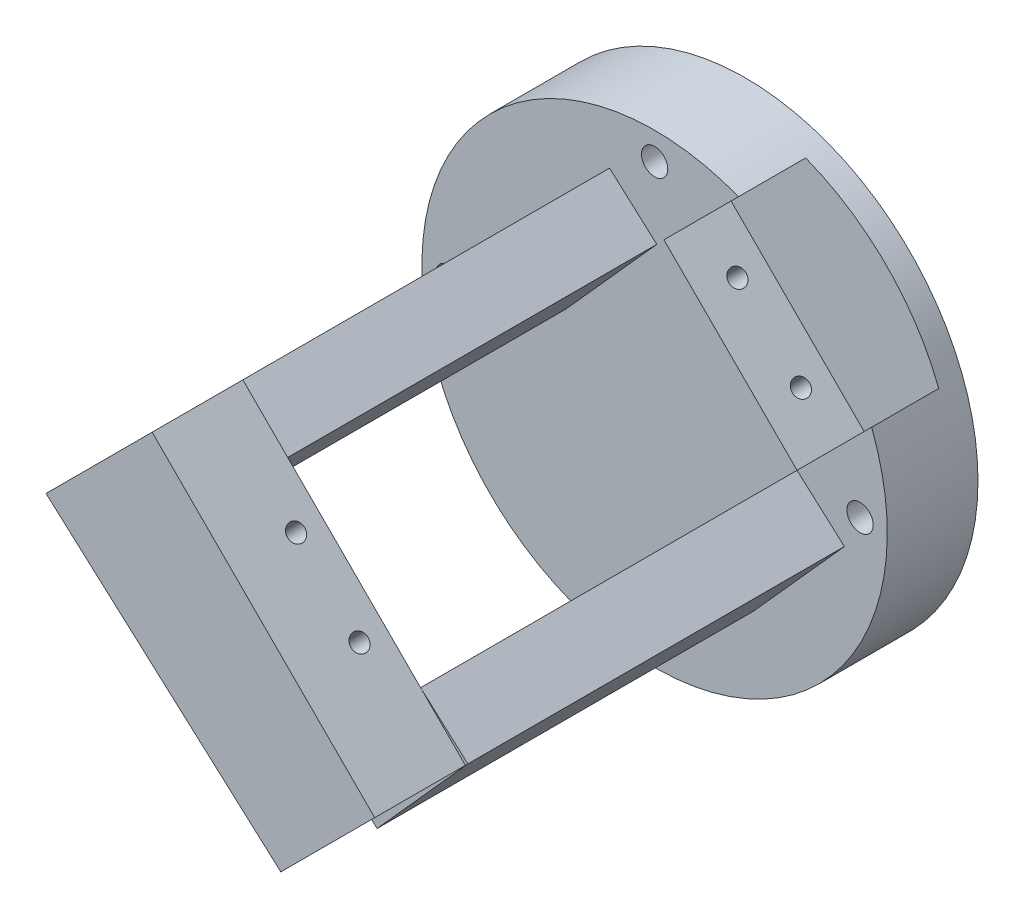
ISO-10303-21;
HEADER;
FILE_DESCRIPTION(('STEP AP214'),'2;1');
FILE_NAME('part.step','',(''),(''),'','','');
FILE_SCHEMA(('AUTOMOTIVE_DESIGN { 1 0 10303 214 1 1 1 1 }'));
ENDSEC;
DATA;
#1=APPLICATION_CONTEXT('core data for automotive mechanical design processes');
#2=APPLICATION_PROTOCOL_DEFINITION('international standard','automotive_design',2000,#1);
#3=PRODUCT_CONTEXT('',#1,'mechanical');
#4=PRODUCT('Part','Part','',(#3));
#5=PRODUCT_RELATED_PRODUCT_CATEGORY('part','',(#4));
#6=PRODUCT_DEFINITION_FORMATION('','',#4);
#7=PRODUCT_DEFINITION_CONTEXT('part definition',#1,'design');
#8=PRODUCT_DEFINITION('design','',#6,#7);
#9=PRODUCT_DEFINITION_SHAPE('','',#8);
#10=(LENGTH_UNIT() NAMED_UNIT(*) SI_UNIT(.MILLI.,.METRE.));
#11=(NAMED_UNIT(*) PLANE_ANGLE_UNIT() SI_UNIT($,.RADIAN.));
#12=(NAMED_UNIT(*) SI_UNIT($,.STERADIAN.) SOLID_ANGLE_UNIT());
#13=UNCERTAINTY_MEASURE_WITH_UNIT(LENGTH_MEASURE(1.E-05),#10,'distance_accuracy_value','');
#14=(GEOMETRIC_REPRESENTATION_CONTEXT(3) GLOBAL_UNCERTAINTY_ASSIGNED_CONTEXT((#13)) GLOBAL_UNIT_ASSIGNED_CONTEXT((#10,
#11,#12)) REPRESENTATION_CONTEXT('',''));
#15=CARTESIAN_POINT('',(0.,0.,0.));
#16=DIRECTION('',(0.,0.,1.));
#17=DIRECTION('',(1.,0.,0.));
#18=AXIS2_PLACEMENT_3D('',#15,#16,#17);
#19=CARTESIAN_POINT('',(0.,0.,51.5));
#20=DIRECTION('',(0.,0.,-1.));
#21=DIRECTION('',(-1.,0.,0.));
#22=AXIS2_PLACEMENT_3D('',#19,#20,#21);
#23=PLANE('',#22);
#24=DIRECTION('',(-0.707106781186547,0.707106781186548,0.));
#25=VECTOR('',#24,1.);
#26=CARTESIAN_POINT('',(20.6435839937851,-3.9134375509114,51.5));
#27=LINE('',#26,#25);
#28=CARTESIAN_POINT('',(20.6435839937851,-3.9134375509114,51.5));
#29=VERTEX_POINT('',#28);
#30=CARTESIAN_POINT('',(15.7013060762473,1.02884036662643,51.5));
#31=VERTEX_POINT('',#30);
#32=EDGE_CURVE('E162',#29,#31,#27,.T.);
#33=ORIENTED_EDGE('',*,*,#32,.F.);
#34=DIRECTION('',(0.707106781186548,0.707106781186547,0.));
#35=VECTOR('',#34,1.);
#36=CARTESIAN_POINT('',(-15.9347408033612,-40.4917623480576,51.5));
#37=LINE('',#36,#35);
#38=CARTESIAN_POINT('',(10.2927771901674,-14.2642443545291,51.5));
#39=VERTEX_POINT('',#38);
#40=EDGE_CURVE('E58',#39,#29,#37,.T.);
#41=ORIENTED_EDGE('',*,*,#40,.F.);
#42=DIRECTION('',(0.744871886143202,-0.667207518867608,0.));
#43=VECTOR('',#42,1.);
#44=CARTESIAN_POINT('',(5.69319329323317,-10.1442379255216,51.5));
#45=LINE('',#44,#43);
#46=CARTESIAN_POINT('',(10.9072964962356,-14.8146905575949,51.5));
#47=VERTEX_POINT('',#46);
#48=EDGE_CURVE('E207',#39,#47,#45,.T.);
#49=ORIENTED_EDGE('',*,*,#48,.T.);
#50=DIRECTION('',(0.667207518867608,0.744871886143202,0.));
#51=VECTOR('',#50,1.);
#52=CARTESIAN_POINT('',(20.9154092792497,-3.64161226544682,51.5));
#53=LINE('',#52,#51);
#54=CARTESIAN_POINT('',(20.9154092792497,-3.64161226544682,51.5));
#55=VERTEX_POINT('',#54);
#56=EDGE_CURVE('E209',#47,#55,#53,.T.);
#57=ORIENTED_EDGE('',*,*,#56,.T.);
#58=DIRECTION('',(-0.744871886143202,0.667207518867608,0.));
#59=VECTOR('',#58,1.);
#60=CARTESIAN_POINT('',(15.7013060762473,1.02884036662643,51.5));
#61=LINE('',#60,#59);
#62=EDGE_CURVE('E201',#55,#31,#61,.T.);
#63=ORIENTED_EDGE('',*,*,#62,.T.);
#64=EDGE_LOOP('',(#33,#41,#49,#57,#63));
#65=FACE_BOUND('',#64,.T.);
#66=ADVANCED_FACE('F43',(#65),#23,.F.);
#67=CARTESIAN_POINT('',(0.,0.,10.));
#68=DIRECTION('',(0.,0.,1.));
#69=DIRECTION('',(1.,0.,0.));
#70=AXIS2_PLACEMENT_3D('',#67,#68,#69);
#71=PLANE('',#70);
#72=DIRECTION('',(-0.744871886143202,0.667207518867608,0.));
#73=VECTOR('',#72,1.);
#74=CARTESIAN_POINT('',(15.7013060762473,1.02884036662643,10.));
#75=LINE('',#74,#73);
#76=CARTESIAN_POINT('',(20.9154092792497,-3.64161226544682,10.));
#77=VERTEX_POINT('',#76);
#78=CARTESIAN_POINT('',(15.7013060762473,1.02884036662643,10.));
#79=VERTEX_POINT('',#78);
#80=EDGE_CURVE('E66',#77,#79,#75,.T.);
#81=ORIENTED_EDGE('',*,*,#80,.F.);
#82=DIRECTION('',(0.667207518867608,0.744871886143202,0.));
#83=VECTOR('',#82,1.);
#84=CARTESIAN_POINT('',(20.9154092792497,-3.64161226544682,10.));
#85=LINE('',#84,#83);
#86=CARTESIAN_POINT('',(10.9072964962356,-14.8146905575949,10.));
#87=VERTEX_POINT('',#86);
#88=EDGE_CURVE('E205',#87,#77,#85,.T.);
#89=ORIENTED_EDGE('',*,*,#88,.F.);
#90=DIRECTION('',(0.744871886143202,-0.667207518867608,0.));
#91=VECTOR('',#90,1.);
#92=CARTESIAN_POINT('',(5.69319329323317,-10.1442379255216,10.));
#93=LINE('',#92,#91);
#94=CARTESIAN_POINT('',(5.69319329323317,-10.1442379255216,10.));
#95=VERTEX_POINT('',#94);
#96=EDGE_CURVE('E217',#95,#87,#93,.T.);
#97=ORIENTED_EDGE('',*,*,#96,.F.);
#98=DIRECTION('',(-0.667207518867608,-0.744871886143202,0.));
#99=VECTOR('',#98,1.);
#100=CARTESIAN_POINT('',(15.7013060762473,1.02884036662643,10.));
#101=LINE('',#100,#99);
#102=EDGE_CURVE('E213',#79,#95,#101,.T.);
#103=ORIENTED_EDGE('',*,*,#102,.F.);
#104=DIRECTION('',(0.707106781186548,-0.707106781186548,0.));
#105=VECTOR('',#104,1.);
#106=CARTESIAN_POINT('',(1.02884036662643,15.7013060762473,9.99999999999999));
#107=LINE('',#106,#105);
#108=CARTESIAN_POINT('',(1.02884036662643,15.7013060762473,10.));
#109=VERTEX_POINT('',#108);
#110=EDGE_CURVE('E258',#109,#79,#107,.T.);
#111=ORIENTED_EDGE('',*,*,#110,.F.);
#112=DIRECTION('',(-0.707106781186548,-0.707106781186548,0.));
#113=VECTOR('',#112,1.);
#114=CARTESIAN_POINT('',(1.02884036662643,15.7013060762473,9.99999999999999));
#115=LINE('',#114,#113);
#116=CARTESIAN_POINT('',(9.25113997816105,23.9236056877819,10.));
#117=VERTEX_POINT('',#116);
#118=EDGE_CURVE('E261',#117,#109,#115,.T.);
#119=ORIENTED_EDGE('',*,*,#118,.F.);
#120=CARTESIAN_POINT('',(0.,0.,10.));
#121=DIRECTION('',(0.,0.,1.));
#122=DIRECTION('',(1.,0.,0.));
#123=AXIS2_PLACEMENT_3D('',#120,#121,#122);
#124=CIRCLE('',#123,25.65);
#125=CARTESIAN_POINT('',(23.9236056877819,9.25113997816105,10.));
#126=VERTEX_POINT('',#125);
#127=EDGE_CURVE('E11',#117,#126,#124,.T.);
#128=ORIENTED_EDGE('',*,*,#127,.T.);
#129=DIRECTION('',(0.707106781186547,0.707106781186548,0.));
#130=VECTOR('',#129,1.);
#131=CARTESIAN_POINT('',(15.7013060762473,1.02884036662643,9.99999999999999));
#132=LINE('',#131,#130);
#133=EDGE_CURVE('E262',#79,#126,#132,.T.);
#134=ORIENTED_EDGE('',*,*,#133,.F.);
#135=EDGE_LOOP('',(#81,#89,#97,#103,#111,#119,#128,#134));
#136=FACE_BOUND('',#135,.T.);
#137=CARTESIAN_POINT('',(2.37246156974391E-13,22.65,10.));
#138=DIRECTION('',(0.,0.,1.));
#139=DIRECTION('',(1.,0.,0.));
#140=AXIS2_PLACEMENT_3D('',#137,#138,#139);
#141=CIRCLE('',#140,1.45);
#142=CARTESIAN_POINT('',(1.45000000000024,22.65,10.));
#143=VERTEX_POINT('',#142);
#144=EDGE_CURVE('E294',#143,#143,#141,.T.);
#145=ORIENTED_EDGE('',*,*,#144,.F.);
#146=EDGE_LOOP('',(#145));
#147=FACE_BOUND('',#146,.T.);
#148=CARTESIAN_POINT('',(0.,-22.65,10.));
#149=DIRECTION('',(0.,0.,1.));
#150=DIRECTION('',(1.,0.,0.));
#151=AXIS2_PLACEMENT_3D('',#148,#149,#150);
#152=CIRCLE('',#151,1.45);
#153=CARTESIAN_POINT('',(1.44999999999992,-22.65,10.));
#154=VERTEX_POINT('',#153);
#155=EDGE_CURVE('E306',#154,#154,#152,.T.);
#156=ORIENTED_EDGE('',*,*,#155,.F.);
#157=EDGE_LOOP('',(#156));
#158=FACE_BOUND('',#157,.T.);
#159=CARTESIAN_POINT('',(22.65,0.,10.));
#160=DIRECTION('',(0.,0.,1.));
#161=DIRECTION('',(1.,0.,0.));
#162=AXIS2_PLACEMENT_3D('',#159,#160,#161);
#163=CIRCLE('',#162,1.45);
#164=CARTESIAN_POINT('',(24.1,0.,10.));
#165=VERTEX_POINT('',#164);
#166=EDGE_CURVE('E300',#165,#165,#163,.T.);
#167=ORIENTED_EDGE('',*,*,#166,.F.);
#168=EDGE_LOOP('',(#167));
#169=FACE_BOUND('',#168,.T.);
#170=CARTESIAN_POINT('',(-22.65,1.58164104649594E-13,10.));
#171=DIRECTION('',(0.,0.,1.));
#172=DIRECTION('',(1.,0.,0.));
#173=AXIS2_PLACEMENT_3D('',#170,#171,#172);
#174=CIRCLE('',#173,1.45);
#175=CARTESIAN_POINT('',(-21.2,1.58164104649594E-13,10.));
#176=VERTEX_POINT('',#175);
#177=EDGE_CURVE('E288',#176,#176,#174,.T.);
#178=ORIENTED_EDGE('',*,*,#177,.F.);
#179=EDGE_LOOP('',(#178));
#180=FACE_BOUND('',#179,.T.);
#181=DIRECTION('',(-0.744871886143202,0.667207518867608,0.));
#182=VECTOR('',#181,1.);
#183=CARTESIAN_POINT('',(0.245214438775858,14.8733963831293,10.));
#184=LINE('',#183,#182);
#185=CARTESIAN_POINT('',(0.245214438775858,14.8733963831293,10.));
#186=VERTEX_POINT('',#185);
#187=CARTESIAN_POINT('',(-4.96888876422655,19.5438490152025,10.));
#188=VERTEX_POINT('',#187);
#189=EDGE_CURVE('E250',#186,#188,#184,.T.);
#190=ORIENTED_EDGE('',*,*,#189,.F.);
#191=DIRECTION('',(0.667207518867607,0.744871886143202,0.));
#192=VECTOR('',#191,1.);
#193=CARTESIAN_POINT('',(0.245214438775858,14.8733963831293,10.));
#194=LINE('',#193,#192);
#195=CARTESIAN_POINT('',(-9.76289834423825,3.70031809098124,10.));
#196=VERTEX_POINT('',#195);
#197=EDGE_CURVE('E214',#196,#186,#194,.T.);
#198=ORIENTED_EDGE('',*,*,#197,.F.);
#199=DIRECTION('',(0.744871886143202,-0.667207518867608,0.));
#200=VECTOR('',#199,1.);
#201=CARTESIAN_POINT('',(-9.76289834423825,3.70031809098124,10.));
#202=LINE('',#201,#200);
#203=CARTESIAN_POINT('',(-14.9770015472407,8.37077072305449,10.));
#204=VERTEX_POINT('',#203);
#205=EDGE_CURVE('E244',#204,#196,#202,.T.);
#206=ORIENTED_EDGE('',*,*,#205,.F.);
#207=DIRECTION('',(-0.667207518867608,-0.744871886143202,0.));
#208=VECTOR('',#207,1.);
#209=CARTESIAN_POINT('',(-4.96888876422655,19.5438490152025,10.));
#210=LINE('',#209,#208);
#211=EDGE_CURVE('E246',#188,#204,#210,.T.);
#212=ORIENTED_EDGE('',*,*,#211,.F.);
#213=EDGE_LOOP('',(#190,#198,#206,#212));
#214=FACE_BOUND('',#213,.T.);
#215=ADVANCED_FACE('F330',(#136,#147,#158,#169,#180,#214),#71,.T.);
#216=CARTESIAN_POINT('',(0.,0.,10.));
#217=DIRECTION('',(0.,0.,-1.));
#218=DIRECTION('',(-1.,0.,0.));
#219=AXIS2_PLACEMENT_3D('',#216,#217,#218);
#220=CYLINDRICAL_SURFACE('',#219,25.65);
#221=CARTESIAN_POINT('',(0.,0.,0.));
#222=DIRECTION('',(0.,0.,1.));
#223=DIRECTION('',(1.,0.,0.));
#224=AXIS2_PLACEMENT_3D('',#221,#222,#223);
#225=CIRCLE('',#224,25.65);
#226=CARTESIAN_POINT('',(25.65,0.,0.));
#227=VERTEX_POINT('',#226);
#228=EDGE_CURVE('E47',#227,#227,#225,.T.);
#229=ORIENTED_EDGE('',*,*,#228,.T.);
#230=EDGE_LOOP('',(#229));
#231=FACE_BOUND('',#230,.T.);
#232=DIRECTION('',(0.,0.,-1.));
#233=VECTOR('',#232,1.);
#234=CARTESIAN_POINT('',(23.9236056877819,9.25113997816105,101.543876092287));
#235=LINE('',#234,#233);
#236=CARTESIAN_POINT('',(23.9236056877819,9.25113997816105,2.6));
#237=VERTEX_POINT('',#236);
#238=EDGE_CURVE('E278',#126,#237,#235,.T.);
#239=ORIENTED_EDGE('',*,*,#238,.F.);
#240=ORIENTED_EDGE('',*,*,#127,.F.);
#241=DIRECTION('',(0.,0.,-1.));
#242=VECTOR('',#241,1.);
#243=CARTESIAN_POINT('',(9.25113997816105,23.9236056877819,101.543876092287));
#244=LINE('',#243,#242);
#245=CARTESIAN_POINT('',(9.25113997816105,23.9236056877819,2.6));
#246=VERTEX_POINT('',#245);
#247=EDGE_CURVE('E273',#117,#246,#244,.T.);
#248=ORIENTED_EDGE('',*,*,#247,.T.);
#249=CARTESIAN_POINT('',(0.,0.,2.6));
#250=DIRECTION('',(0.,0.,1.));
#251=DIRECTION('',(1.,0.,0.));
#252=AXIS2_PLACEMENT_3D('',#249,#250,#251);
#253=CIRCLE('',#252,25.65);
#254=EDGE_CURVE('E232',#237,#246,#253,.T.);
#255=ORIENTED_EDGE('',*,*,#254,.F.);
#256=EDGE_LOOP('',(#239,#240,#248,#255));
#257=FACE_BOUND('',#256,.T.);
#258=ADVANCED_FACE('F45',(#231,#257),#220,.T.);
#259=CARTESIAN_POINT('',(0.,0.,0.));
#260=DIRECTION('',(0.,0.,1.));
#261=DIRECTION('',(1.,0.,0.));
#262=AXIS2_PLACEMENT_3D('',#259,#260,#261);
#263=PLANE('',#262);
#264=ORIENTED_EDGE('',*,*,#228,.F.);
#265=EDGE_LOOP('',(#264));
#266=FACE_BOUND('',#265,.T.);
#267=CARTESIAN_POINT('',(0.,-22.65,0.));
#268=DIRECTION('',(0.,0.,1.));
#269=DIRECTION('',(1.,0.,0.));
#270=AXIS2_PLACEMENT_3D('',#267,#268,#269);
#271=CIRCLE('',#270,1.45);
#272=CARTESIAN_POINT('',(1.44999999999992,-22.65,0.));
#273=VERTEX_POINT('',#272);
#274=EDGE_CURVE('E303',#273,#273,#271,.T.);
#275=ORIENTED_EDGE('',*,*,#274,.T.);
#276=EDGE_LOOP('',(#275));
#277=FACE_BOUND('',#276,.T.);
#278=CARTESIAN_POINT('',(22.65,0.,0.));
#279=DIRECTION('',(0.,0.,1.));
#280=DIRECTION('',(1.,0.,0.));
#281=AXIS2_PLACEMENT_3D('',#278,#279,#280);
#282=CIRCLE('',#281,1.45);
#283=CARTESIAN_POINT('',(24.1,0.,0.));
#284=VERTEX_POINT('',#283);
#285=EDGE_CURVE('E297',#284,#284,#282,.T.);
#286=ORIENTED_EDGE('',*,*,#285,.T.);
#287=EDGE_LOOP('',(#286));
#288=FACE_BOUND('',#287,.T.);
#289=CARTESIAN_POINT('',(2.37246156974391E-13,22.65,0.));
#290=DIRECTION('',(0.,0.,1.));
#291=DIRECTION('',(1.,0.,0.));
#292=AXIS2_PLACEMENT_3D('',#289,#290,#291);
#293=CIRCLE('',#292,1.45);
#294=CARTESIAN_POINT('',(1.45000000000024,22.65,0.));
#295=VERTEX_POINT('',#294);
#296=EDGE_CURVE('E291',#295,#295,#293,.T.);
#297=ORIENTED_EDGE('',*,*,#296,.T.);
#298=EDGE_LOOP('',(#297));
#299=FACE_BOUND('',#298,.T.);
#300=CARTESIAN_POINT('',(-22.65,1.58164104649594E-13,0.));
#301=DIRECTION('',(0.,0.,1.));
#302=DIRECTION('',(1.,0.,0.));
#303=AXIS2_PLACEMENT_3D('',#300,#301,#302);
#304=CIRCLE('',#303,1.45);
#305=CARTESIAN_POINT('',(-21.2,1.58164104649594E-13,0.));
#306=VERTEX_POINT('',#305);
#307=EDGE_CURVE('E265',#306,#306,#304,.T.);
#308=ORIENTED_EDGE('',*,*,#307,.T.);
#309=EDGE_LOOP('',(#308));
#310=FACE_BOUND('',#309,.T.);
#311=ADVANCED_FACE('F312',(#266,#277,#288,#299,#310),#263,.F.);
#312=CARTESIAN_POINT('',(0.,-22.65,10.));
#313=DIRECTION('',(0.,0.,-1.));
#314=DIRECTION('',(-1.,0.,0.));
#315=AXIS2_PLACEMENT_3D('',#312,#313,#314);
#316=CYLINDRICAL_SURFACE('',#315,1.45);
#317=ORIENTED_EDGE('',*,*,#155,.T.);
#318=EDGE_LOOP('',(#317));
#319=FACE_BOUND('',#318,.T.);
#320=ORIENTED_EDGE('',*,*,#274,.F.);
#321=EDGE_LOOP('',(#320));
#322=FACE_BOUND('',#321,.T.);
#323=ADVANCED_FACE('F315',(#319,#322),#316,.F.);
#324=CARTESIAN_POINT('',(22.65,0.,10.));
#325=DIRECTION('',(0.,0.,-1.));
#326=DIRECTION('',(-1.,0.,0.));
#327=AXIS2_PLACEMENT_3D('',#324,#325,#326);
#328=CYLINDRICAL_SURFACE('',#327,1.45);
#329=ORIENTED_EDGE('',*,*,#166,.T.);
#330=EDGE_LOOP('',(#329));
#331=FACE_BOUND('',#330,.T.);
#332=ORIENTED_EDGE('',*,*,#285,.F.);
#333=EDGE_LOOP('',(#332));
#334=FACE_BOUND('',#333,.T.);
#335=ADVANCED_FACE('F317',(#331,#334),#328,.F.);
#336=CARTESIAN_POINT('',(2.37246156974391E-13,22.65,10.));
#337=DIRECTION('',(0.,0.,-1.));
#338=DIRECTION('',(-1.,0.,0.));
#339=AXIS2_PLACEMENT_3D('',#336,#337,#338);
#340=CYLINDRICAL_SURFACE('',#339,1.45);
#341=ORIENTED_EDGE('',*,*,#144,.T.);
#342=EDGE_LOOP('',(#341));
#343=FACE_BOUND('',#342,.T.);
#344=ORIENTED_EDGE('',*,*,#296,.F.);
#345=EDGE_LOOP('',(#344));
#346=FACE_BOUND('',#345,.T.);
#347=ADVANCED_FACE('F324',(#343,#346),#340,.F.);
#348=CARTESIAN_POINT('',(-22.65,1.58164104649594E-13,10.));
#349=DIRECTION('',(0.,0.,-1.));
#350=DIRECTION('',(-1.,0.,0.));
#351=AXIS2_PLACEMENT_3D('',#348,#349,#350);
#352=CYLINDRICAL_SURFACE('',#351,1.45);
#353=ORIENTED_EDGE('',*,*,#177,.T.);
#354=EDGE_LOOP('',(#353));
#355=FACE_BOUND('',#354,.T.);
#356=ORIENTED_EDGE('',*,*,#307,.F.);
#357=EDGE_LOOP('',(#356));
#358=FACE_BOUND('',#357,.T.);
#359=ADVANCED_FACE('F372',(#355,#358),#352,.F.);
#360=CARTESIAN_POINT('',(15.7013060762473,1.02884036662643,101.543876092287));
#361=DIRECTION('',(-0.707106781186548,0.707106781186547,0.));
#362=DIRECTION('',(-0.707106781186547,-0.707106781186548,0.));
#363=AXIS2_PLACEMENT_3D('',#360,#361,#362);
#364=PLANE('',#363);
#365=DIRECTION('',(0.,0.,-1.));
#366=VECTOR('',#365,1.);
#367=CARTESIAN_POINT('',(15.7013060762473,1.02884036662643,101.543876092287));
#368=LINE('',#367,#366);
#369=CARTESIAN_POINT('',(15.7013060762473,1.02884036662643,2.6));
#370=VERTEX_POINT('',#369);
#371=EDGE_CURVE('E281',#79,#370,#368,.T.);
#372=ORIENTED_EDGE('',*,*,#371,.F.);
#373=ORIENTED_EDGE('',*,*,#133,.T.);
#374=ORIENTED_EDGE('',*,*,#238,.T.);
#375=DIRECTION('',(0.707106781186547,0.707106781186548,0.));
#376=VECTOR('',#375,1.);
#377=CARTESIAN_POINT('',(15.7013060762473,1.02884036662643,2.6));
#378=LINE('',#377,#376);
#379=EDGE_CURVE('E270',#370,#237,#378,.T.);
#380=ORIENTED_EDGE('',*,*,#379,.F.);
#381=EDGE_LOOP('',(#372,#373,#374,#380));
#382=FACE_BOUND('',#381,.T.);
#383=ADVANCED_FACE('F368',(#382),#364,.T.);
#384=CARTESIAN_POINT('',(1.02884036662643,15.7013060762473,101.543876092287));
#385=DIRECTION('',(0.707106781186547,0.707106781186547,0.));
#386=DIRECTION('',(-0.707106781186548,0.707106781186548,0.));
#387=AXIS2_PLACEMENT_3D('',#384,#385,#386);
#388=PLANE('',#387);
#389=CARTESIAN_POINT('',(4.86489465456345,11.8652517883103,5.74));
#390=DIRECTION('',(0.707106781186548,0.707106781186547,0.));
#391=DIRECTION('',(-0.707106781186547,0.707106781186548,0.));
#392=AXIS2_PLACEMENT_3D('',#389,#390,#391);
#393=CIRCLE('',#392,0.95);
#394=CARTESIAN_POINT('',(4.19314321243623,12.5370032304375,5.74));
#395=VERTEX_POINT('',#394);
#396=EDGE_CURVE('E527',#395,#395,#393,.T.);
#397=ORIENTED_EDGE('',*,*,#396,.F.);
#398=EDGE_LOOP('',(#397));
#399=FACE_BOUND('',#398,.T.);
#400=CARTESIAN_POINT('',(11.8652517883103,4.86489465456345,5.73999999999999));
#401=DIRECTION('',(0.707106781186548,0.707106781186547,0.));
#402=DIRECTION('',(-0.707106781186547,0.707106781186548,0.));
#403=AXIS2_PLACEMENT_3D('',#400,#401,#402);
#404=CIRCLE('',#403,0.949999999999999);
#405=CARTESIAN_POINT('',(11.193500346183,5.53664609669067,5.73999999999999));
#406=VERTEX_POINT('',#405);
#407=EDGE_CURVE('E530',#406,#406,#404,.T.);
#408=ORIENTED_EDGE('',*,*,#407,.F.);
#409=EDGE_LOOP('',(#408));
#410=FACE_BOUND('',#409,.T.);
#411=DIRECTION('',(0.,0.,-1.));
#412=VECTOR('',#411,1.);
#413=CARTESIAN_POINT('',(1.02884036662643,15.7013060762473,101.543876092287));
#414=LINE('',#413,#412);
#415=CARTESIAN_POINT('',(1.02884036662643,15.7013060762473,2.6));
#416=VERTEX_POINT('',#415);
#417=EDGE_CURVE('E275',#109,#416,#414,.T.);
#418=ORIENTED_EDGE('',*,*,#417,.F.);
#419=ORIENTED_EDGE('',*,*,#110,.T.);
#420=ORIENTED_EDGE('',*,*,#371,.T.);
#421=DIRECTION('',(0.707106781186548,-0.707106781186548,0.));
#422=VECTOR('',#421,1.);
#423=CARTESIAN_POINT('',(1.02884036662643,15.7013060762473,2.6));
#424=LINE('',#423,#422);
#425=EDGE_CURVE('E268',#416,#370,#424,.T.);
#426=ORIENTED_EDGE('',*,*,#425,.F.);
#427=EDGE_LOOP('',(#418,#419,#420,#426));
#428=FACE_BOUND('',#427,.T.);
#429=ADVANCED_FACE('F371',(#399,#410,#428),#388,.T.);
#430=CARTESIAN_POINT('',(1.02884036662643,15.7013060762473,101.543876092287));
#431=DIRECTION('',(0.707106781186548,-0.707106781186548,0.));
#432=DIRECTION('',(0.707106781186548,0.707106781186548,0.));
#433=AXIS2_PLACEMENT_3D('',#430,#431,#432);
#434=PLANE('',#433);
#435=ORIENTED_EDGE('',*,*,#247,.F.);
#436=ORIENTED_EDGE('',*,*,#118,.T.);
#437=ORIENTED_EDGE('',*,*,#417,.T.);
#438=DIRECTION('',(-0.707106781186548,-0.707106781186548,0.));
#439=VECTOR('',#438,1.);
#440=CARTESIAN_POINT('',(1.02884036662643,15.7013060762473,2.6));
#441=LINE('',#440,#439);
#442=EDGE_CURVE('E266',#246,#416,#441,.T.);
#443=ORIENTED_EDGE('',*,*,#442,.F.);
#444=EDGE_LOOP('',(#435,#436,#437,#443));
#445=FACE_BOUND('',#444,.T.);
#446=ADVANCED_FACE('F376',(#445),#434,.T.);
#447=CARTESIAN_POINT('',(0.,0.,2.6));
#448=DIRECTION('',(0.,0.,1.));
#449=DIRECTION('',(1.,0.,0.));
#450=AXIS2_PLACEMENT_3D('',#447,#448,#449);
#451=PLANE('',#450);
#452=ORIENTED_EDGE('',*,*,#442,.T.);
#453=ORIENTED_EDGE('',*,*,#425,.T.);
#454=ORIENTED_EDGE('',*,*,#379,.T.);
#455=ORIENTED_EDGE('',*,*,#254,.T.);
#456=EDGE_LOOP('',(#452,#453,#454,#455));
#457=FACE_BOUND('',#456,.T.);
#458=ADVANCED_FACE('F360',(#457),#451,.T.);
#459=CARTESIAN_POINT('',(0.245214438775858,14.8733963831293,51.5));
#460=DIRECTION('',(-0.744871886143202,0.667207518867607,0.));
#461=DIRECTION('',(-0.667207518867607,-0.744871886143202,0.));
#462=AXIS2_PLACEMENT_3D('',#459,#460,#461);
#463=PLANE('',#462);
#464=ORIENTED_EDGE('',*,*,#197,.T.);
#465=DIRECTION('',(0.,0.,-1.));
#466=VECTOR('',#465,1.);
#467=CARTESIAN_POINT('',(0.245214438775858,14.8733963831293,51.5));
#468=LINE('',#467,#466);
#469=CARTESIAN_POINT('',(0.245214438775858,14.8733963831293,51.5));
#470=VERTEX_POINT('',#469);
#471=EDGE_CURVE('E233',#470,#186,#468,.T.);
#472=ORIENTED_EDGE('',*,*,#471,.F.);
#473=DIRECTION('',(0.667207518867607,0.744871886143202,0.));
#474=VECTOR('',#473,1.);
#475=CARTESIAN_POINT('',(0.245214438775858,14.8733963831293,51.5));
#476=LINE('',#475,#474);
#477=CARTESIAN_POINT('',(-9.76289834423825,3.70031809098124,51.5));
#478=VERTEX_POINT('',#477);
#479=EDGE_CURVE('E247',#478,#470,#476,.T.);
#480=ORIENTED_EDGE('',*,*,#479,.F.);
#481=DIRECTION('',(0.,0.,-1.));
#482=VECTOR('',#481,1.);
#483=CARTESIAN_POINT('',(-9.76289834423825,3.70031809098124,51.5));
#484=LINE('',#483,#482);
#485=EDGE_CURVE('E240',#478,#196,#484,.T.);
#486=ORIENTED_EDGE('',*,*,#485,.T.);
#487=EDGE_LOOP('',(#464,#472,#480,#486));
#488=FACE_BOUND('',#487,.T.);
#489=ADVANCED_FACE('F357',(#488),#463,.F.);
#490=CARTESIAN_POINT('',(0.245214438775858,14.8733963831293,51.5));
#491=DIRECTION('',(-0.667207518867608,-0.744871886143202,0.));
#492=DIRECTION('',(0.744871886143202,-0.667207518867608,0.));
#493=AXIS2_PLACEMENT_3D('',#490,#491,#492);
#494=PLANE('',#493);
#495=ORIENTED_EDGE('',*,*,#189,.T.);
#496=DIRECTION('',(0.,0.,-1.));
#497=VECTOR('',#496,1.);
#498=CARTESIAN_POINT('',(-4.96888876422655,19.5438490152025,51.5));
#499=LINE('',#498,#497);
#500=CARTESIAN_POINT('',(-4.96888876422655,19.5438490152025,51.5));
#501=VERTEX_POINT('',#500);
#502=EDGE_CURVE('E235',#501,#188,#499,.T.);
#503=ORIENTED_EDGE('',*,*,#502,.F.);
#504=DIRECTION('',(-0.744871886143202,0.667207518867608,0.));
#505=VECTOR('',#504,1.);
#506=CARTESIAN_POINT('',(0.245214438775858,14.8733963831293,51.5));
#507=LINE('',#506,#505);
#508=EDGE_CURVE('E173',#470,#501,#507,.T.);
#509=ORIENTED_EDGE('',*,*,#508,.F.);
#510=ORIENTED_EDGE('',*,*,#471,.T.);
#511=EDGE_LOOP('',(#495,#503,#509,#510));
#512=FACE_BOUND('',#511,.T.);
#513=ADVANCED_FACE('F359',(#512),#494,.F.);
#514=CARTESIAN_POINT('',(-4.96888876422655,19.5438490152025,51.5));
#515=DIRECTION('',(0.744871886143202,-0.667207518867608,0.));
#516=DIRECTION('',(0.667207518867608,0.744871886143202,0.));
#517=AXIS2_PLACEMENT_3D('',#514,#515,#516);
#518=PLANE('',#517);
#519=ORIENTED_EDGE('',*,*,#211,.T.);
#520=DIRECTION('',(0.,0.,-1.));
#521=VECTOR('',#520,1.);
#522=CARTESIAN_POINT('',(-14.9770015472407,8.3707707230545,51.5));
#523=LINE('',#522,#521);
#524=CARTESIAN_POINT('',(-14.9770015472407,8.3707707230545,51.5));
#525=VERTEX_POINT('',#524);
#526=EDGE_CURVE('E238',#525,#204,#523,.T.);
#527=ORIENTED_EDGE('',*,*,#526,.F.);
#528=DIRECTION('',(-0.667207518867608,-0.744871886143202,0.));
#529=VECTOR('',#528,1.);
#530=CARTESIAN_POINT('',(-4.96888876422655,19.5438490152025,51.5));
#531=LINE('',#530,#529);
#532=EDGE_CURVE('E243',#501,#525,#531,.T.);
#533=ORIENTED_EDGE('',*,*,#532,.F.);
#534=ORIENTED_EDGE('',*,*,#502,.T.);
#535=EDGE_LOOP('',(#519,#527,#533,#534));
#536=FACE_BOUND('',#535,.T.);
#537=ADVANCED_FACE('F355',(#536),#518,.F.);
#538=CARTESIAN_POINT('',(15.7013060762473,1.02884036662643,51.5));
#539=DIRECTION('',(-0.667207518867608,-0.744871886143202,0.));
#540=DIRECTION('',(0.744871886143202,-0.667207518867608,0.));
#541=AXIS2_PLACEMENT_3D('',#538,#539,#540);
#542=PLANE('',#541);
#543=ORIENTED_EDGE('',*,*,#80,.T.);
#544=DIRECTION('',(0.,0.,-1.));
#545=VECTOR('',#544,1.);
#546=CARTESIAN_POINT('',(15.7013060762473,1.02884036662643,51.5));
#547=LINE('',#546,#545);
#548=EDGE_CURVE('E229',#31,#79,#547,.T.);
#549=ORIENTED_EDGE('',*,*,#548,.F.);
#550=ORIENTED_EDGE('',*,*,#62,.F.);
#551=DIRECTION('',(0.,0.,-1.));
#552=VECTOR('',#551,1.);
#553=CARTESIAN_POINT('',(20.9154092792497,-3.64161226544682,51.5));
#554=LINE('',#553,#552);
#555=EDGE_CURVE('E211',#55,#77,#554,.T.);
#556=ORIENTED_EDGE('',*,*,#555,.T.);
#557=EDGE_LOOP('',(#543,#549,#550,#556));
#558=FACE_BOUND('',#557,.T.);
#559=ADVANCED_FACE('F351',(#558),#542,.F.);
#560=CARTESIAN_POINT('',(15.7013060762473,1.02884036662643,51.5));
#561=DIRECTION('',(0.744871886143202,-0.667207518867608,0.));
#562=DIRECTION('',(0.667207518867608,0.744871886143202,0.));
#563=AXIS2_PLACEMENT_3D('',#560,#561,#562);
#564=PLANE('',#563);
#565=ORIENTED_EDGE('',*,*,#102,.T.);
#566=DIRECTION('',(0.,0.,-1.));
#567=VECTOR('',#566,1.);
#568=CARTESIAN_POINT('',(5.69319329323317,-10.1442379255216,51.5));
#569=LINE('',#568,#567);
#570=CARTESIAN_POINT('',(5.69319329323317,-10.1442379255216,51.5));
#571=VERTEX_POINT('',#570);
#572=EDGE_CURVE('E226',#571,#95,#569,.T.);
#573=ORIENTED_EDGE('',*,*,#572,.F.);
#574=DIRECTION('',(-0.667207518867608,-0.744871886143202,0.));
#575=VECTOR('',#574,1.);
#576=CARTESIAN_POINT('',(15.7013060762473,1.02884036662643,51.5));
#577=LINE('',#576,#575);
#578=EDGE_CURVE('E204',#31,#571,#577,.T.);
#579=ORIENTED_EDGE('',*,*,#578,.F.);
#580=ORIENTED_EDGE('',*,*,#548,.T.);
#581=EDGE_LOOP('',(#565,#573,#579,#580));
#582=FACE_BOUND('',#581,.T.);
#583=ADVANCED_FACE('F347',(#582),#564,.F.);
#584=CARTESIAN_POINT('',(5.69319329323317,-10.1442379255216,51.5));
#585=DIRECTION('',(0.667207518867608,0.744871886143202,0.));
#586=DIRECTION('',(-0.744871886143202,0.667207518867608,0.));
#587=AXIS2_PLACEMENT_3D('',#584,#585,#586);
#588=PLANE('',#587);
#589=ORIENTED_EDGE('',*,*,#96,.T.);
#590=DIRECTION('',(0.,0.,-1.));
#591=VECTOR('',#590,1.);
#592=CARTESIAN_POINT('',(10.9072964962356,-14.8146905575949,51.5));
#593=LINE('',#592,#591);
#594=EDGE_CURVE('E223',#47,#87,#593,.T.);
#595=ORIENTED_EDGE('',*,*,#594,.F.);
#596=ORIENTED_EDGE('',*,*,#48,.F.);
#597=DIRECTION('',(0.,0.,1.));
#598=VECTOR('',#597,1.);
#599=CARTESIAN_POINT('',(10.2927771901674,-14.2642443545291,51.5));
#600=LINE('',#599,#598);
#601=CARTESIAN_POINT('',(10.2927771901674,-14.2642443545291,61.5));
#602=VERTEX_POINT('',#601);
#603=EDGE_CURVE('E421',#39,#602,#600,.T.);
#604=ORIENTED_EDGE('',*,*,#603,.T.);
#605=DIRECTION('',(-0.744871886143202,0.667207518867608,0.));
#606=VECTOR('',#605,1.);
#607=CARTESIAN_POINT('',(8.77551517618524,-12.905180275654,61.5));
#608=LINE('',#607,#606);
#609=CARTESIAN_POINT('',(-15.5915208533088,8.92121692612027,61.5));
#610=VERTEX_POINT('',#609);
#611=EDGE_CURVE('E192',#602,#610,#608,.T.);
#612=ORIENTED_EDGE('',*,*,#611,.T.);
#613=DIRECTION('',(0.,0.,-1.));
#614=VECTOR('',#613,1.);
#615=CARTESIAN_POINT('',(-15.5915208533088,8.92121692612027,51.5));
#616=LINE('',#615,#614);
#617=CARTESIAN_POINT('',(-15.5915208533088,8.92121692612027,51.5));
#618=VERTEX_POINT('',#617);
#619=EDGE_CURVE('E200',#610,#618,#616,.T.);
#620=ORIENTED_EDGE('',*,*,#619,.T.);
#621=DIRECTION('',(0.744871886143202,-0.667207518867608,0.));
#622=VECTOR('',#621,1.);
#623=CARTESIAN_POINT('',(8.77551517618524,-12.905180275654,51.5));
#624=LINE('',#623,#622);
#625=EDGE_CURVE('E415',#618,#525,#624,.T.);
#626=ORIENTED_EDGE('',*,*,#625,.T.);
#627=ORIENTED_EDGE('',*,*,#526,.T.);
#628=ORIENTED_EDGE('',*,*,#205,.T.);
#629=ORIENTED_EDGE('',*,*,#485,.F.);
#630=EDGE_CURVE('E417',#478,#571,#624,.T.);
#631=ORIENTED_EDGE('',*,*,#630,.T.);
#632=ORIENTED_EDGE('',*,*,#572,.T.);
#633=EDGE_LOOP('',(#589,#595,#596,#604,#612,#620,#626,#627,#628,#629,#631,#632));
#634=FACE_BOUND('',#633,.T.);
#635=CARTESIAN_POINT('',(-6.35374006271142,0.646617071035405,54.39));
#636=DIRECTION('',(0.667207518867608,0.744871886143202,0.));
#637=DIRECTION('',(0.744871886143202,-0.667207518867608,0.));
#638=AXIS2_PLACEMENT_3D('',#635,#636,#637);
#639=ELLIPSE('',#638,0.951435790003712,0.949999999999994);
#640=CARTESIAN_POINT('',(-5.64504229126721,0.0118119582251865,54.39));
#641=VERTEX_POINT('',#640);
#642=EDGE_CURVE('E196',#641,#641,#639,.F.);
#643=ORIENTED_EDGE('',*,*,#642,.F.);
#644=EDGE_LOOP('',(#643));
#645=FACE_BOUND('',#644,.T.);
#646=CARTESIAN_POINT('',(1.03163671339147,-5.96872042035534,54.39));
#647=DIRECTION('',(0.667207518867608,0.744871886143202,0.));
#648=DIRECTION('',(0.744871886143202,-0.667207518867608,0.));
#649=AXIS2_PLACEMENT_3D('',#646,#647,#648);
#650=ELLIPSE('',#649,0.951435790003712,0.949999999999994);
#651=CARTESIAN_POINT('',(1.74033448483568,-6.60352553316556,54.39));
#652=VERTEX_POINT('',#651);
#653=EDGE_CURVE('E199',#652,#652,#650,.F.);
#654=ORIENTED_EDGE('',*,*,#653,.F.);
#655=EDGE_LOOP('',(#654));
#656=FACE_BOUND('',#655,.T.);
#657=ADVANCED_FACE('F343',(#634,#645,#656),#588,.F.);
#658=CARTESIAN_POINT('',(20.9154092792497,-3.64161226544682,51.5));
#659=DIRECTION('',(-0.744871886143202,0.667207518867608,0.));
#660=DIRECTION('',(-0.667207518867608,-0.744871886143202,0.));
#661=AXIS2_PLACEMENT_3D('',#658,#659,#660);
#662=PLANE('',#661);
#663=ORIENTED_EDGE('',*,*,#88,.T.);
#664=ORIENTED_EDGE('',*,*,#555,.F.);
#665=ORIENTED_EDGE('',*,*,#56,.F.);
#666=ORIENTED_EDGE('',*,*,#594,.T.);
#667=EDGE_LOOP('',(#663,#664,#665,#666));
#668=FACE_BOUND('',#667,.T.);
#669=ADVANCED_FACE('F341',(#668),#662,.F.);
#670=CARTESIAN_POINT('',(-15.9347408033612,-40.4917623480576,51.5));
#671=DIRECTION('',(0.,0.,-1.));
#672=DIRECTION('',(-1.,0.,0.));
#673=AXIS2_PLACEMENT_3D('',#670,#671,#672);
#674=PLANE('',#673);
#675=ORIENTED_EDGE('',*,*,#630,.F.);
#676=ORIENTED_EDGE('',*,*,#479,.T.);
#677=ORIENTED_EDGE('',*,*,#508,.T.);
#678=DIRECTION('',(0.707106781186548,0.707106781186547,0.));
#679=VECTOR('',#678,1.);
#680=CARTESIAN_POINT('',(-40.4696204654239,-15.9568826859949,51.5));
#681=LINE('',#680,#679);
#682=CARTESIAN_POINT('',(-3.89129566827767,20.6214421111514,51.5));
#683=VERTEX_POINT('',#682);
#684=EDGE_CURVE('E169',#501,#683,#681,.T.);
#685=ORIENTED_EDGE('',*,*,#684,.T.);
#686=EDGE_CURVE('E155',#31,#683,#27,.T.);
#687=ORIENTED_EDGE('',*,*,#686,.F.);
#688=ORIENTED_EDGE('',*,*,#578,.T.);
#689=EDGE_LOOP('',(#675,#676,#677,#685,#687,#688));
#690=FACE_BOUND('',#689,.T.);
#691=ADVANCED_FACE('F171',(#690),#674,.T.);
#692=CARTESIAN_POINT('',(-40.4696204654239,-15.9568826859949,51.5));
#693=DIRECTION('',(-0.707106781186547,0.707106781186548,0.));
#694=DIRECTION('',(-0.707106781186548,-0.707106781186547,0.));
#695=AXIS2_PLACEMENT_3D('',#692,#693,#694);
#696=PLANE('',#695);
#697=ORIENTED_EDGE('',*,*,#619,.F.);
#698=DIRECTION('',(0.707106781186548,0.707106781186547,0.));
#699=VECTOR('',#698,1.);
#700=CARTESIAN_POINT('',(-40.4696204654239,-15.9568826859949,61.5));
#701=LINE('',#700,#699);
#702=CARTESIAN_POINT('',(-3.89129566827767,20.6214421111514,61.5));
#703=VERTEX_POINT('',#702);
#704=EDGE_CURVE('E183',#610,#703,#701,.T.);
#705=ORIENTED_EDGE('',*,*,#704,.T.);
#706=DIRECTION('',(0.,0.,1.));
#707=VECTOR('',#706,1.);
#708=CARTESIAN_POINT('',(-3.89129566827767,20.6214421111514,51.5));
#709=LINE('',#708,#707);
#710=EDGE_CURVE('E160',#683,#703,#709,.T.);
#711=ORIENTED_EDGE('',*,*,#710,.F.);
#712=ORIENTED_EDGE('',*,*,#684,.F.);
#713=EDGE_CURVE('E177',#618,#501,#681,.T.);
#714=ORIENTED_EDGE('',*,*,#713,.F.);
#715=EDGE_LOOP('',(#697,#705,#711,#712,#714));
#716=FACE_BOUND('',#715,.T.);
#717=ADVANCED_FACE('F181',(#716),#696,.T.);
#718=CARTESIAN_POINT('',(-15.9347408033612,-40.4917623480576,61.5));
#719=DIRECTION('',(0.,0.,1.));
#720=DIRECTION('',(1.,0.,0.));
#721=AXIS2_PLACEMENT_3D('',#718,#719,#720);
#722=PLANE('',#721);
#723=ORIENTED_EDGE('',*,*,#611,.F.);
#724=DIRECTION('',(0.707106781186548,0.707106781186547,0.));
#725=VECTOR('',#724,1.);
#726=CARTESIAN_POINT('',(-15.9347408033612,-40.4917623480576,61.5));
#727=LINE('',#726,#725);
#728=CARTESIAN_POINT('',(20.6435839937851,-3.9134375509114,61.5));
#729=VERTEX_POINT('',#728);
#730=EDGE_CURVE('E193',#602,#729,#727,.T.);
#731=ORIENTED_EDGE('',*,*,#730,.T.);
#732=DIRECTION('',(0.707106781186547,-0.707106781186548,0.));
#733=VECTOR('',#732,1.);
#734=CARTESIAN_POINT('',(20.6435839937851,-3.9134375509114,61.5));
#735=LINE('',#734,#733);
#736=EDGE_CURVE('E185',#703,#729,#735,.T.);
#737=ORIENTED_EDGE('',*,*,#736,.F.);
#738=ORIENTED_EDGE('',*,*,#704,.F.);
#739=EDGE_LOOP('',(#723,#731,#737,#738));
#740=FACE_BOUND('',#739,.T.);
#741=ADVANCED_FACE('F451',(#740),#722,.T.);
#742=CARTESIAN_POINT('',(-15.9347408033612,-40.4917623480576,51.5));
#743=DIRECTION('',(0.707106781186547,-0.707106781186548,0.));
#744=DIRECTION('',(0.707106781186548,0.707106781186547,0.));
#745=AXIS2_PLACEMENT_3D('',#742,#743,#744);
#746=PLANE('',#745);
#747=ORIENTED_EDGE('',*,*,#603,.F.);
#748=ORIENTED_EDGE('',*,*,#40,.T.);
#749=DIRECTION('',(0.,0.,-1.));
#750=VECTOR('',#749,1.);
#751=CARTESIAN_POINT('',(20.6435839937851,-3.9134375509114,51.5));
#752=LINE('',#751,#750);
#753=EDGE_CURVE('E178',#729,#29,#752,.T.);
#754=ORIENTED_EDGE('',*,*,#753,.F.);
#755=ORIENTED_EDGE('',*,*,#730,.F.);
#756=EDGE_LOOP('',(#747,#748,#754,#755));
#757=FACE_BOUND('',#756,.T.);
#758=ADVANCED_FACE('F448',(#757),#746,.T.);
#759=ORIENTED_EDGE('',*,*,#713,.T.);
#760=ORIENTED_EDGE('',*,*,#532,.T.);
#761=ORIENTED_EDGE('',*,*,#625,.F.);
#762=EDGE_LOOP('',(#759,#760,#761));
#763=FACE_BOUND('',#762,.T.);
#764=ADVANCED_FACE('F339',(#763),#674,.T.);
#765=CARTESIAN_POINT('',(-24.713073008836,-31.7134301425828,54.39));
#766=DIRECTION('',(0.707106781186548,0.707106781186547,0.));
#767=DIRECTION('',(-0.707106781186547,0.707106781186548,0.));
#768=AXIS2_PLACEMENT_3D('',#765,#766,#767);
#769=CYLINDRICAL_SURFACE('',#768,0.949999999999994);
#770=ORIENTED_EDGE('',*,*,#653,.T.);
#771=EDGE_LOOP('',(#770));
#772=FACE_BOUND('',#771,.T.);
#773=CARTESIAN_POINT('',(11.8652517883103,4.86489465456345,54.39));
#774=DIRECTION('',(0.707106781186548,0.707106781186547,0.));
#775=DIRECTION('',(0.707106781186547,-0.707106781186548,0.));
#776=AXIS2_PLACEMENT_3D('',#773,#774,#775);
#777=CIRCLE('',#776,0.949999999999994);
#778=CARTESIAN_POINT('',(12.5370032304375,4.19314321243623,54.39));
#779=VERTEX_POINT('',#778);
#780=EDGE_CURVE('E165',#779,#779,#777,.T.);
#781=ORIENTED_EDGE('',*,*,#780,.T.);
#782=EDGE_LOOP('',(#781));
#783=FACE_BOUND('',#782,.T.);
#784=ADVANCED_FACE('F431',(#772,#783),#769,.F.);
#785=CARTESIAN_POINT('',(8.36507322143686,8.36507322143686,0.));
#786=DIRECTION('',(0.707106781186548,0.707106781186547,0.));
#787=DIRECTION('',(-0.707106781186547,0.707106781186548,0.));
#788=AXIS2_PLACEMENT_3D('',#785,#786,#787);
#789=PLANE('',#788);
#790=CARTESIAN_POINT('',(4.86489465456344,11.8652517883103,54.39));
#791=DIRECTION('',(0.707106781186548,0.707106781186547,0.));
#792=DIRECTION('',(0.707106781186547,-0.707106781186548,0.));
#793=AXIS2_PLACEMENT_3D('',#790,#791,#792);
#794=CIRCLE('',#793,0.949999999999994);
#795=CARTESIAN_POINT('',(5.53664609669066,11.1935003461831,54.39));
#796=VERTEX_POINT('',#795);
#797=EDGE_CURVE('E425',#796,#796,#794,.T.);
#798=ORIENTED_EDGE('',*,*,#797,.F.);
#799=EDGE_LOOP('',(#798));
#800=FACE_BOUND('',#799,.T.);
#801=ORIENTED_EDGE('',*,*,#780,.F.);
#802=EDGE_LOOP('',(#801));
#803=FACE_BOUND('',#802,.T.);
#804=ORIENTED_EDGE('',*,*,#32,.T.);
#805=ORIENTED_EDGE('',*,*,#686,.T.);
#806=ORIENTED_EDGE('',*,*,#710,.T.);
#807=ORIENTED_EDGE('',*,*,#736,.T.);
#808=ORIENTED_EDGE('',*,*,#753,.T.);
#809=EDGE_LOOP('',(#804,#805,#806,#807,#808));
#810=FACE_BOUND('',#809,.T.);
#811=ADVANCED_FACE('F157',(#800,#803,#810),#789,.T.);
#812=CARTESIAN_POINT('',(-31.7134301425828,-24.713073008836,54.39));
#813=DIRECTION('',(0.707106781186548,0.707106781186547,0.));
#814=DIRECTION('',(-0.707106781186547,0.707106781186548,0.));
#815=AXIS2_PLACEMENT_3D('',#812,#813,#814);
#816=CYLINDRICAL_SURFACE('',#815,0.949999999999994);
#817=ORIENTED_EDGE('',*,*,#642,.T.);
#818=EDGE_LOOP('',(#817));
#819=FACE_BOUND('',#818,.T.);
#820=ORIENTED_EDGE('',*,*,#797,.T.);
#821=EDGE_LOOP('',(#820));
#822=FACE_BOUND('',#821,.T.);
#823=ADVANCED_FACE('F434',(#819,#822),#816,.F.);
#824=CARTESIAN_POINT('',(1.25865007051206,-5.74170706323475,5.73999999999999));
#825=DIRECTION('',(0.707106781186548,0.707106781186547,0.));
#826=DIRECTION('',(-0.707106781186547,0.707106781186548,0.));
#827=AXIS2_PLACEMENT_3D('',#824,#825,#826);
#828=CYLINDRICAL_SURFACE('',#827,0.949999999999999);
#829=CARTESIAN_POINT('',(1.25865007051206,-5.74170706323475,5.73999999999999));
#830=DIRECTION('',(0.707106781186548,0.707106781186547,0.));
#831=DIRECTION('',(-0.707106781186547,0.707106781186548,0.));
#832=AXIS2_PLACEMENT_3D('',#829,#830,#831);
#833=CIRCLE('',#832,0.949999999999999);
#834=CARTESIAN_POINT('',(0.586898628384839,-5.06995562110753,5.73999999999999));
#835=VERTEX_POINT('',#834);
#836=EDGE_CURVE('E427',#835,#835,#833,.T.);
#837=ORIENTED_EDGE('',*,*,#836,.F.);
#838=EDGE_LOOP('',(#837));
#839=FACE_BOUND('',#838,.T.);
#840=ORIENTED_EDGE('',*,*,#407,.T.);
#841=EDGE_LOOP('',(#840));
#842=FACE_BOUND('',#841,.T.);
#843=ADVANCED_FACE('F441',(#839,#842),#828,.F.);
#844=CARTESIAN_POINT('',(1.25865007051206,-5.74170706323475,5.73999999999999));
#845=DIRECTION('',(0.707106781186548,0.707106781186547,0.));
#846=DIRECTION('',(-0.707106781186547,0.707106781186548,0.));
#847=AXIS2_PLACEMENT_3D('',#844,#845,#846);
#848=PLANE('',#847);
#849=ORIENTED_EDGE('',*,*,#836,.T.);
#850=EDGE_LOOP('',(#849));
#851=FACE_BOUND('',#850,.T.);
#852=ADVANCED_FACE('F491',(#851),#848,.T.);
#853=CARTESIAN_POINT('',(-5.74170706323476,1.25865007051207,5.74));
#854=DIRECTION('',(0.707106781186548,0.707106781186547,0.));
#855=DIRECTION('',(-0.707106781186547,0.707106781186548,0.));
#856=AXIS2_PLACEMENT_3D('',#853,#854,#855);
#857=CYLINDRICAL_SURFACE('',#856,0.95);
#858=CARTESIAN_POINT('',(-5.74170706323476,1.25865007051207,5.74));
#859=DIRECTION('',(0.707106781186548,0.707106781186547,0.));
#860=DIRECTION('',(-0.707106781186547,0.707106781186548,0.));
#861=AXIS2_PLACEMENT_3D('',#858,#859,#860);
#862=CIRCLE('',#861,0.95);
#863=CARTESIAN_POINT('',(-6.41345850536198,1.93040151263929,5.74));
#864=VERTEX_POINT('',#863);
#865=EDGE_CURVE('E526',#864,#864,#862,.T.);
#866=ORIENTED_EDGE('',*,*,#865,.F.);
#867=EDGE_LOOP('',(#866));
#868=FACE_BOUND('',#867,.T.);
#869=ORIENTED_EDGE('',*,*,#396,.T.);
#870=EDGE_LOOP('',(#869));
#871=FACE_BOUND('',#870,.T.);
#872=ADVANCED_FACE('F501',(#868,#871),#857,.F.);
#873=CARTESIAN_POINT('',(-5.74170706323476,1.25865007051207,5.74));
#874=DIRECTION('',(0.707106781186548,0.707106781186547,0.));
#875=DIRECTION('',(-0.707106781186547,0.707106781186548,0.));
#876=AXIS2_PLACEMENT_3D('',#873,#874,#875);
#877=PLANE('',#876);
#878=ORIENTED_EDGE('',*,*,#865,.T.);
#879=EDGE_LOOP('',(#878));
#880=FACE_BOUND('',#879,.T.);
#881=ADVANCED_FACE('F511',(#880),#877,.T.);
#882=CLOSED_SHELL('',(#66,#215,#258,#311,#323,#335,#347,#359,#383,#429,#446,#458,#489,#513,#537,
#559,#583,#657,#669,#691,#717,#741,#758,#764,#784,#811,#823,#843,#852,#872,#881));
#883=MANIFOLD_SOLID_BREP('B2',#882);
#884=ADVANCED_BREP_SHAPE_REPRESENTATION('',(#18,#883),#14);
#885=SHAPE_DEFINITION_REPRESENTATION(#9,#884);
ENDSEC;
END-ISO-10303-21;
